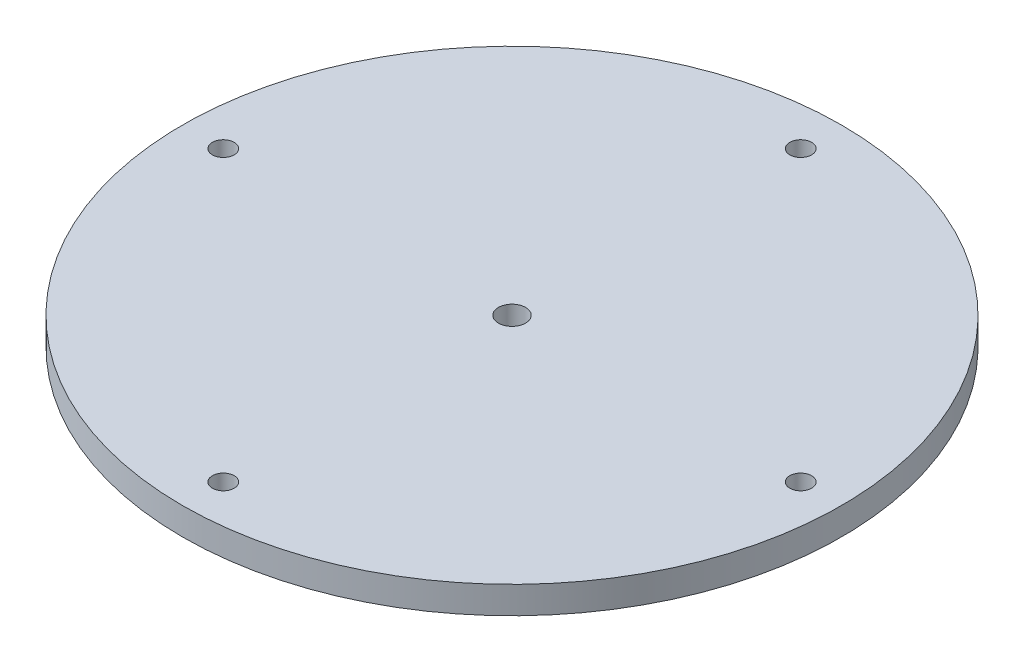
ISO-10303-21;
HEADER;
FILE_DESCRIPTION(('STEP AP214'),'2;1');
FILE_NAME('part.step','',(''),(''),'','','');
FILE_SCHEMA(('AUTOMOTIVE_DESIGN { 1 0 10303 214 1 1 1 1 }'));
ENDSEC;
DATA;
#1=APPLICATION_CONTEXT('core data for automotive mechanical design processes');
#2=APPLICATION_PROTOCOL_DEFINITION('international standard','automotive_design',2000,#1);
#3=PRODUCT_CONTEXT('',#1,'mechanical');
#4=PRODUCT('Part','Part','',(#3));
#5=PRODUCT_RELATED_PRODUCT_CATEGORY('part','',(#4));
#6=PRODUCT_DEFINITION_FORMATION('','',#4);
#7=PRODUCT_DEFINITION_CONTEXT('part definition',#1,'design');
#8=PRODUCT_DEFINITION('design','',#6,#7);
#9=PRODUCT_DEFINITION_SHAPE('','',#8);
#10=(LENGTH_UNIT() NAMED_UNIT(*) SI_UNIT(.MILLI.,.METRE.));
#11=(NAMED_UNIT(*) PLANE_ANGLE_UNIT() SI_UNIT($,.RADIAN.));
#12=(NAMED_UNIT(*) SI_UNIT($,.STERADIAN.) SOLID_ANGLE_UNIT());
#13=UNCERTAINTY_MEASURE_WITH_UNIT(LENGTH_MEASURE(1.E-05),#10,'distance_accuracy_value','');
#14=(GEOMETRIC_REPRESENTATION_CONTEXT(3) GLOBAL_UNCERTAINTY_ASSIGNED_CONTEXT((#13)) GLOBAL_UNIT_ASSIGNED_CONTEXT((#10,
#11,#12)) REPRESENTATION_CONTEXT('',''));
#15=CARTESIAN_POINT('',(0.,0.,0.));
#16=DIRECTION('',(0.,0.,1.));
#17=DIRECTION('',(1.,0.,0.));
#18=AXIS2_PLACEMENT_3D('',#15,#16,#17);
#19=CARTESIAN_POINT('',(0.,5.,0.));
#20=DIRECTION('',(0.,1.,0.));
#21=DIRECTION('',(0.,0.,1.));
#22=AXIS2_PLACEMENT_3D('',#19,#20,#21);
#23=PLANE('',#22);
#24=CARTESIAN_POINT('',(-53.,5.,5.55145532876058E-13));
#25=DIRECTION('',(0.,-1.,0.));
#26=DIRECTION('',(0.,0.,-1.));
#27=AXIS2_PLACEMENT_3D('',#24,#25,#26);
#28=CIRCLE('',#27,2.);
#29=CARTESIAN_POINT('',(-53.,5.,-1.99999999999945));
#30=VERTEX_POINT('',#29);
#31=EDGE_CURVE('E89',#30,#30,#28,.T.);
#32=ORIENTED_EDGE('',*,*,#31,.T.);
#33=EDGE_LOOP('',(#32));
#34=FACE_BOUND('',#33,.T.);
#35=CARTESIAN_POINT('',(-3.70097021917372E-13,5.,-53.));
#36=DIRECTION('',(0.,-1.,0.));
#37=DIRECTION('',(0.,0.,-1.));
#38=AXIS2_PLACEMENT_3D('',#35,#36,#37);
#39=CIRCLE('',#38,2.);
#40=CARTESIAN_POINT('',(-3.70097021917372E-13,5.,-55.));
#41=VERTEX_POINT('',#40);
#42=EDGE_CURVE('E83',#41,#41,#39,.T.);
#43=ORIENTED_EDGE('',*,*,#42,.T.);
#44=EDGE_LOOP('',(#43));
#45=FACE_BOUND('',#44,.T.);
#46=CARTESIAN_POINT('',(53.,5.,-1.85048510958686E-13));
#47=DIRECTION('',(0.,-1.,0.));
#48=DIRECTION('',(0.,0.,-1.));
#49=AXIS2_PLACEMENT_3D('',#46,#47,#48);
#50=CIRCLE('',#49,2.);
#51=CARTESIAN_POINT('',(53.,5.,-2.00000000000019));
#52=VERTEX_POINT('',#51);
#53=EDGE_CURVE('E77',#52,#52,#50,.T.);
#54=ORIENTED_EDGE('',*,*,#53,.T.);
#55=EDGE_LOOP('',(#54));
#56=FACE_BOUND('',#55,.T.);
#57=CARTESIAN_POINT('',(0.,5.,53.));
#58=DIRECTION('',(0.,-1.,0.));
#59=DIRECTION('',(0.,0.,-1.));
#60=AXIS2_PLACEMENT_3D('',#57,#58,#59);
#61=CIRCLE('',#60,2.);
#62=CARTESIAN_POINT('',(0.,5.,51.));
#63=VERTEX_POINT('',#62);
#64=EDGE_CURVE('E71',#63,#63,#61,.T.);
#65=ORIENTED_EDGE('',*,*,#64,.T.);
#66=EDGE_LOOP('',(#65));
#67=FACE_BOUND('',#66,.T.);
#68=CARTESIAN_POINT('',(0.,5.,0.));
#69=DIRECTION('',(0.,1.,0.));
#70=DIRECTION('',(0.,0.,1.));
#71=AXIS2_PLACEMENT_3D('',#68,#69,#70);
#72=CIRCLE('',#71,60.5);
#73=CARTESIAN_POINT('',(0.,5.,60.5));
#74=VERTEX_POINT('',#73);
#75=EDGE_CURVE('E10',#74,#74,#72,.T.);
#76=ORIENTED_EDGE('',*,*,#75,.T.);
#77=EDGE_LOOP('',(#76));
#78=FACE_BOUND('',#77,.T.);
#79=CARTESIAN_POINT('',(0.,5.,0.));
#80=DIRECTION('',(0.,1.,0.));
#81=DIRECTION('',(0.,0.,1.));
#82=AXIS2_PLACEMENT_3D('',#79,#80,#81);
#83=CIRCLE('',#82,2.5);
#84=CARTESIAN_POINT('',(0.,5.,2.5));
#85=VERTEX_POINT('',#84);
#86=EDGE_CURVE('E42',#85,#85,#83,.T.);
#87=ORIENTED_EDGE('',*,*,#86,.F.);
#88=EDGE_LOOP('',(#87));
#89=FACE_BOUND('',#88,.T.);
#90=ADVANCED_FACE('F31',(#34,#45,#56,#67,#78,#89),#23,.T.);
#91=CARTESIAN_POINT('',(0.,0.,0.));
#92=DIRECTION('',(0.,1.,0.));
#93=DIRECTION('',(0.,0.,1.));
#94=AXIS2_PLACEMENT_3D('',#91,#92,#93);
#95=PLANE('',#94);
#96=CARTESIAN_POINT('',(-52.9999999999985,0.,-1.50635059981141E-12));
#97=DIRECTION('',(0.,-1.,0.));
#98=DIRECTION('',(0.,0.,-1.));
#99=AXIS2_PLACEMENT_3D('',#96,#97,#98);
#100=CIRCLE('',#99,5.00000000000241);
#101=CARTESIAN_POINT('',(-52.9999999999985,0.,-5.00000000000392));
#102=VERTEX_POINT('',#101);
#103=EDGE_CURVE('E68',#102,#102,#100,.T.);
#104=ORIENTED_EDGE('',*,*,#103,.F.);
#105=EDGE_LOOP('',(#104));
#106=FACE_BOUND('',#105,.T.);
#107=CARTESIAN_POINT('',(2.99971994355186E-12,0.,-53.));
#108=DIRECTION('',(0.,-1.,0.));
#109=DIRECTION('',(0.,0.,-1.));
#110=AXIS2_PLACEMENT_3D('',#107,#108,#109);
#111=CIRCLE('',#110,5.00000000000322);
#112=CARTESIAN_POINT('',(2.99971994355186E-12,0.,-58.0000000000032));
#113=VERTEX_POINT('',#112);
#114=EDGE_CURVE('E62',#113,#113,#111,.T.);
#115=ORIENTED_EDGE('',*,*,#114,.F.);
#116=EDGE_LOOP('',(#115));
#117=FACE_BOUND('',#116,.T.);
#118=CARTESIAN_POINT('',(53.0000000000015,0.,1.49985997177593E-12));
#119=DIRECTION('',(0.,-1.,0.));
#120=DIRECTION('',(0.,0.,-1.));
#121=AXIS2_PLACEMENT_3D('',#118,#119,#120);
#122=CIRCLE('',#121,5.00000000000117);
#123=CARTESIAN_POINT('',(53.0000000000015,0.,-4.99999999999967));
#124=VERTEX_POINT('',#123);
#125=EDGE_CURVE('E56',#124,#124,#122,.T.);
#126=ORIENTED_EDGE('',*,*,#125,.F.);
#127=EDGE_LOOP('',(#126));
#128=FACE_BOUND('',#127,.T.);
#129=CARTESIAN_POINT('',(0.,0.,53.));
#130=DIRECTION('',(0.,-1.,0.));
#131=DIRECTION('',(0.,0.,-1.));
#132=AXIS2_PLACEMENT_3D('',#129,#130,#131);
#133=CIRCLE('',#132,5.);
#134=CARTESIAN_POINT('',(0.,0.,48.));
#135=VERTEX_POINT('',#134);
#136=EDGE_CURVE('E50',#135,#135,#133,.T.);
#137=ORIENTED_EDGE('',*,*,#136,.F.);
#138=EDGE_LOOP('',(#137));
#139=FACE_BOUND('',#138,.T.);
#140=CARTESIAN_POINT('',(0.,0.,0.));
#141=DIRECTION('',(0.,1.,0.));
#142=DIRECTION('',(0.,0.,1.));
#143=AXIS2_PLACEMENT_3D('',#140,#141,#142);
#144=CIRCLE('',#143,60.5);
#145=CARTESIAN_POINT('',(0.,0.,60.5));
#146=VERTEX_POINT('',#145);
#147=EDGE_CURVE('E35',#146,#146,#144,.T.);
#148=ORIENTED_EDGE('',*,*,#147,.F.);
#149=EDGE_LOOP('',(#148));
#150=FACE_BOUND('',#149,.T.);
#151=CARTESIAN_POINT('',(0.,0.,0.));
#152=DIRECTION('',(0.,1.,0.));
#153=DIRECTION('',(0.,0.,1.));
#154=AXIS2_PLACEMENT_3D('',#151,#152,#153);
#155=CIRCLE('',#154,2.5);
#156=CARTESIAN_POINT('',(0.,0.,2.5));
#157=VERTEX_POINT('',#156);
#158=EDGE_CURVE('E44',#157,#157,#155,.T.);
#159=ORIENTED_EDGE('',*,*,#158,.T.);
#160=EDGE_LOOP('',(#159));
#161=FACE_BOUND('',#160,.T.);
#162=ADVANCED_FACE('F121',(#106,#117,#128,#139,#150,#161),#95,.F.);
#163=CARTESIAN_POINT('',(0.,5.,0.));
#164=DIRECTION('',(0.,-1.,0.));
#165=DIRECTION('',(0.,0.,-1.));
#166=AXIS2_PLACEMENT_3D('',#163,#164,#165);
#167=CYLINDRICAL_SURFACE('',#166,60.5);
#168=ORIENTED_EDGE('',*,*,#75,.F.);
#169=EDGE_LOOP('',(#168));
#170=FACE_BOUND('',#169,.T.);
#171=ORIENTED_EDGE('',*,*,#147,.T.);
#172=EDGE_LOOP('',(#171));
#173=FACE_BOUND('',#172,.T.);
#174=ADVANCED_FACE('F33',(#170,#173),#167,.T.);
#175=CARTESIAN_POINT('',(0.,5.,0.));
#176=DIRECTION('',(0.,-1.,0.));
#177=DIRECTION('',(0.,0.,-1.));
#178=AXIS2_PLACEMENT_3D('',#175,#176,#177);
#179=CYLINDRICAL_SURFACE('',#178,2.5);
#180=ORIENTED_EDGE('',*,*,#86,.T.);
#181=EDGE_LOOP('',(#180));
#182=FACE_BOUND('',#181,.T.);
#183=ORIENTED_EDGE('',*,*,#158,.F.);
#184=EDGE_LOOP('',(#183));
#185=FACE_BOUND('',#184,.T.);
#186=ADVANCED_FACE('F134',(#182,#185),#179,.F.);
#187=CARTESIAN_POINT('',(0.,2.,53.));
#188=DIRECTION('',(0.,-1.,0.));
#189=DIRECTION('',(0.,0.,-1.));
#190=AXIS2_PLACEMENT_3D('',#187,#188,#189);
#191=CYLINDRICAL_SURFACE('',#190,5.);
#192=CARTESIAN_POINT('',(0.,2.,53.));
#193=DIRECTION('',(0.,-1.,0.));
#194=DIRECTION('',(0.,0.,-1.));
#195=AXIS2_PLACEMENT_3D('',#192,#193,#194);
#196=CIRCLE('',#195,5.);
#197=CARTESIAN_POINT('',(0.,2.,48.));
#198=VERTEX_POINT('',#197);
#199=EDGE_CURVE('E47',#198,#198,#196,.T.);
#200=ORIENTED_EDGE('',*,*,#199,.F.);
#201=EDGE_LOOP('',(#200));
#202=FACE_BOUND('',#201,.T.);
#203=ORIENTED_EDGE('',*,*,#136,.T.);
#204=EDGE_LOOP('',(#203));
#205=FACE_BOUND('',#204,.T.);
#206=ADVANCED_FACE('F136',(#202,#205),#191,.F.);
#207=CARTESIAN_POINT('',(0.,2.,53.));
#208=DIRECTION('',(0.,-1.,0.));
#209=DIRECTION('',(0.,0.,-1.));
#210=AXIS2_PLACEMENT_3D('',#207,#208,#209);
#211=PLANE('',#210);
#212=CARTESIAN_POINT('',(0.,2.,53.));
#213=DIRECTION('',(0.,-1.,0.));
#214=DIRECTION('',(0.,0.,-1.));
#215=AXIS2_PLACEMENT_3D('',#212,#213,#214);
#216=CIRCLE('',#215,2.);
#217=CARTESIAN_POINT('',(0.,2.,51.));
#218=VERTEX_POINT('',#217);
#219=EDGE_CURVE('E74',#218,#218,#216,.T.);
#220=ORIENTED_EDGE('',*,*,#219,.F.);
#221=EDGE_LOOP('',(#220));
#222=FACE_BOUND('',#221,.T.);
#223=ORIENTED_EDGE('',*,*,#199,.T.);
#224=EDGE_LOOP('',(#223));
#225=FACE_BOUND('',#224,.T.);
#226=ADVANCED_FACE('F143',(#222,#225),#211,.T.);
#227=CARTESIAN_POINT('',(53.0000000000015,2.,1.49985997177593E-12));
#228=DIRECTION('',(0.,-1.,0.));
#229=DIRECTION('',(0.,0.,-1.));
#230=AXIS2_PLACEMENT_3D('',#227,#228,#229);
#231=CYLINDRICAL_SURFACE('',#230,5.00000000000117);
#232=CARTESIAN_POINT('',(53.0000000000015,2.,1.49985997177593E-12));
#233=DIRECTION('',(0.,-1.,0.));
#234=DIRECTION('',(0.,0.,-1.));
#235=AXIS2_PLACEMENT_3D('',#232,#233,#234);
#236=CIRCLE('',#235,5.00000000000117);
#237=CARTESIAN_POINT('',(53.0000000000015,2.,-4.99999999999967));
#238=VERTEX_POINT('',#237);
#239=EDGE_CURVE('E53',#238,#238,#236,.T.);
#240=ORIENTED_EDGE('',*,*,#239,.F.);
#241=EDGE_LOOP('',(#240));
#242=FACE_BOUND('',#241,.T.);
#243=ORIENTED_EDGE('',*,*,#125,.T.);
#244=EDGE_LOOP('',(#243));
#245=FACE_BOUND('',#244,.T.);
#246=ADVANCED_FACE('F163',(#242,#245),#231,.F.);
#247=CARTESIAN_POINT('',(53.0000000000015,2.,1.49985997177593E-12));
#248=DIRECTION('',(0.,-1.,0.));
#249=DIRECTION('',(0.,0.,-1.));
#250=AXIS2_PLACEMENT_3D('',#247,#248,#249);
#251=PLANE('',#250);
#252=CARTESIAN_POINT('',(53.,2.,-1.85048510958686E-13));
#253=DIRECTION('',(0.,-1.,0.));
#254=DIRECTION('',(0.,0.,-1.));
#255=AXIS2_PLACEMENT_3D('',#252,#253,#254);
#256=CIRCLE('',#255,2.);
#257=CARTESIAN_POINT('',(53.,2.,-2.00000000000019));
#258=VERTEX_POINT('',#257);
#259=EDGE_CURVE('E80',#258,#258,#256,.T.);
#260=ORIENTED_EDGE('',*,*,#259,.F.);
#261=EDGE_LOOP('',(#260));
#262=FACE_BOUND('',#261,.T.);
#263=ORIENTED_EDGE('',*,*,#239,.T.);
#264=EDGE_LOOP('',(#263));
#265=FACE_BOUND('',#264,.T.);
#266=ADVANCED_FACE('F172',(#262,#265),#251,.T.);
#267=CARTESIAN_POINT('',(2.99971994355186E-12,2.,-53.));
#268=DIRECTION('',(0.,-1.,0.));
#269=DIRECTION('',(0.,0.,-1.));
#270=AXIS2_PLACEMENT_3D('',#267,#268,#269);
#271=CYLINDRICAL_SURFACE('',#270,5.00000000000322);
#272=CARTESIAN_POINT('',(2.99971994355186E-12,2.,-53.));
#273=DIRECTION('',(0.,-1.,0.));
#274=DIRECTION('',(0.,0.,-1.));
#275=AXIS2_PLACEMENT_3D('',#272,#273,#274);
#276=CIRCLE('',#275,5.00000000000322);
#277=CARTESIAN_POINT('',(2.99971994355186E-12,2.,-58.0000000000032));
#278=VERTEX_POINT('',#277);
#279=EDGE_CURVE('E59',#278,#278,#276,.T.);
#280=ORIENTED_EDGE('',*,*,#279,.F.);
#281=EDGE_LOOP('',(#280));
#282=FACE_BOUND('',#281,.T.);
#283=ORIENTED_EDGE('',*,*,#114,.T.);
#284=EDGE_LOOP('',(#283));
#285=FACE_BOUND('',#284,.T.);
#286=ADVANCED_FACE('F177',(#282,#285),#271,.F.);
#287=CARTESIAN_POINT('',(2.99971994355186E-12,2.,-53.));
#288=DIRECTION('',(0.,-1.,0.));
#289=DIRECTION('',(0.,0.,-1.));
#290=AXIS2_PLACEMENT_3D('',#287,#288,#289);
#291=PLANE('',#290);
#292=CARTESIAN_POINT('',(-3.70097021917372E-13,2.,-53.));
#293=DIRECTION('',(0.,-1.,0.));
#294=DIRECTION('',(0.,0.,-1.));
#295=AXIS2_PLACEMENT_3D('',#292,#293,#294);
#296=CIRCLE('',#295,2.);
#297=CARTESIAN_POINT('',(-3.70097021917372E-13,2.,-55.));
#298=VERTEX_POINT('',#297);
#299=EDGE_CURVE('E86',#298,#298,#296,.T.);
#300=ORIENTED_EDGE('',*,*,#299,.F.);
#301=EDGE_LOOP('',(#300));
#302=FACE_BOUND('',#301,.T.);
#303=ORIENTED_EDGE('',*,*,#279,.T.);
#304=EDGE_LOOP('',(#303));
#305=FACE_BOUND('',#304,.T.);
#306=ADVANCED_FACE('F117',(#302,#305),#291,.T.);
#307=CARTESIAN_POINT('',(-52.9999999999985,2.,-1.50635059981141E-12));
#308=DIRECTION('',(0.,-1.,0.));
#309=DIRECTION('',(0.,0.,-1.));
#310=AXIS2_PLACEMENT_3D('',#307,#308,#309);
#311=CYLINDRICAL_SURFACE('',#310,5.00000000000241);
#312=CARTESIAN_POINT('',(-52.9999999999985,2.,-1.50635059981141E-12));
#313=DIRECTION('',(0.,-1.,0.));
#314=DIRECTION('',(0.,0.,-1.));
#315=AXIS2_PLACEMENT_3D('',#312,#313,#314);
#316=CIRCLE('',#315,5.00000000000241);
#317=CARTESIAN_POINT('',(-52.9999999999985,2.,-5.00000000000392));
#318=VERTEX_POINT('',#317);
#319=EDGE_CURVE('E65',#318,#318,#316,.T.);
#320=ORIENTED_EDGE('',*,*,#319,.F.);
#321=EDGE_LOOP('',(#320));
#322=FACE_BOUND('',#321,.T.);
#323=ORIENTED_EDGE('',*,*,#103,.T.);
#324=EDGE_LOOP('',(#323));
#325=FACE_BOUND('',#324,.T.);
#326=ADVANCED_FACE('F111',(#322,#325),#311,.F.);
#327=CARTESIAN_POINT('',(-52.9999999999985,2.,-1.50635059981141E-12));
#328=DIRECTION('',(0.,-1.,0.));
#329=DIRECTION('',(0.,0.,-1.));
#330=AXIS2_PLACEMENT_3D('',#327,#328,#329);
#331=PLANE('',#330);
#332=CARTESIAN_POINT('',(-53.,2.,5.55145532876058E-13));
#333=DIRECTION('',(0.,-1.,0.));
#334=DIRECTION('',(0.,0.,-1.));
#335=AXIS2_PLACEMENT_3D('',#332,#333,#334);
#336=CIRCLE('',#335,2.);
#337=CARTESIAN_POINT('',(-53.,2.,-1.99999999999945));
#338=VERTEX_POINT('',#337);
#339=EDGE_CURVE('E92',#338,#338,#336,.T.);
#340=ORIENTED_EDGE('',*,*,#339,.F.);
#341=EDGE_LOOP('',(#340));
#342=FACE_BOUND('',#341,.T.);
#343=ORIENTED_EDGE('',*,*,#319,.T.);
#344=EDGE_LOOP('',(#343));
#345=FACE_BOUND('',#344,.T.);
#346=ADVANCED_FACE('F107',(#342,#345),#331,.T.);
#347=CARTESIAN_POINT('',(0.,5.,53.));
#348=DIRECTION('',(0.,-1.,0.));
#349=DIRECTION('',(0.,0.,-1.));
#350=AXIS2_PLACEMENT_3D('',#347,#348,#349);
#351=CYLINDRICAL_SURFACE('',#350,2.);
#352=ORIENTED_EDGE('',*,*,#64,.F.);
#353=EDGE_LOOP('',(#352));
#354=FACE_BOUND('',#353,.T.);
#355=ORIENTED_EDGE('',*,*,#219,.T.);
#356=EDGE_LOOP('',(#355));
#357=FACE_BOUND('',#356,.T.);
#358=ADVANCED_FACE('F110',(#354,#357),#351,.F.);
#359=CARTESIAN_POINT('',(53.,5.,-1.85048510958686E-13));
#360=DIRECTION('',(0.,-1.,0.));
#361=DIRECTION('',(0.,0.,-1.));
#362=AXIS2_PLACEMENT_3D('',#359,#360,#361);
#363=CYLINDRICAL_SURFACE('',#362,2.);
#364=ORIENTED_EDGE('',*,*,#53,.F.);
#365=EDGE_LOOP('',(#364));
#366=FACE_BOUND('',#365,.T.);
#367=ORIENTED_EDGE('',*,*,#259,.T.);
#368=EDGE_LOOP('',(#367));
#369=FACE_BOUND('',#368,.T.);
#370=ADVANCED_FACE('F204',(#366,#369),#363,.F.);
#371=CARTESIAN_POINT('',(-3.70097021917372E-13,5.,-53.));
#372=DIRECTION('',(0.,-1.,0.));
#373=DIRECTION('',(0.,0.,-1.));
#374=AXIS2_PLACEMENT_3D('',#371,#372,#373);
#375=CYLINDRICAL_SURFACE('',#374,2.);
#376=ORIENTED_EDGE('',*,*,#42,.F.);
#377=EDGE_LOOP('',(#376));
#378=FACE_BOUND('',#377,.T.);
#379=ORIENTED_EDGE('',*,*,#299,.T.);
#380=EDGE_LOOP('',(#379));
#381=FACE_BOUND('',#380,.T.);
#382=ADVANCED_FACE('F103',(#378,#381),#375,.F.);
#383=CARTESIAN_POINT('',(-53.,5.,5.55145532876058E-13));
#384=DIRECTION('',(0.,-1.,0.));
#385=DIRECTION('',(0.,0.,-1.));
#386=AXIS2_PLACEMENT_3D('',#383,#384,#385);
#387=CYLINDRICAL_SURFACE('',#386,2.);
#388=ORIENTED_EDGE('',*,*,#31,.F.);
#389=EDGE_LOOP('',(#388));
#390=FACE_BOUND('',#389,.T.);
#391=ORIENTED_EDGE('',*,*,#339,.T.);
#392=EDGE_LOOP('',(#391));
#393=FACE_BOUND('',#392,.T.);
#394=ADVANCED_FACE('F100',(#390,#393),#387,.F.);
#395=CLOSED_SHELL('',(#90,#162,#174,#186,#206,#226,#246,#266,#286,#306,#326,#346,#358,#370,#382,#394));
#396=MANIFOLD_SOLID_BREP('B2',#395);
#397=ADVANCED_BREP_SHAPE_REPRESENTATION('',(#18,#396),#14);
#398=SHAPE_DEFINITION_REPRESENTATION(#9,#397);
ENDSEC;
END-ISO-10303-21;
